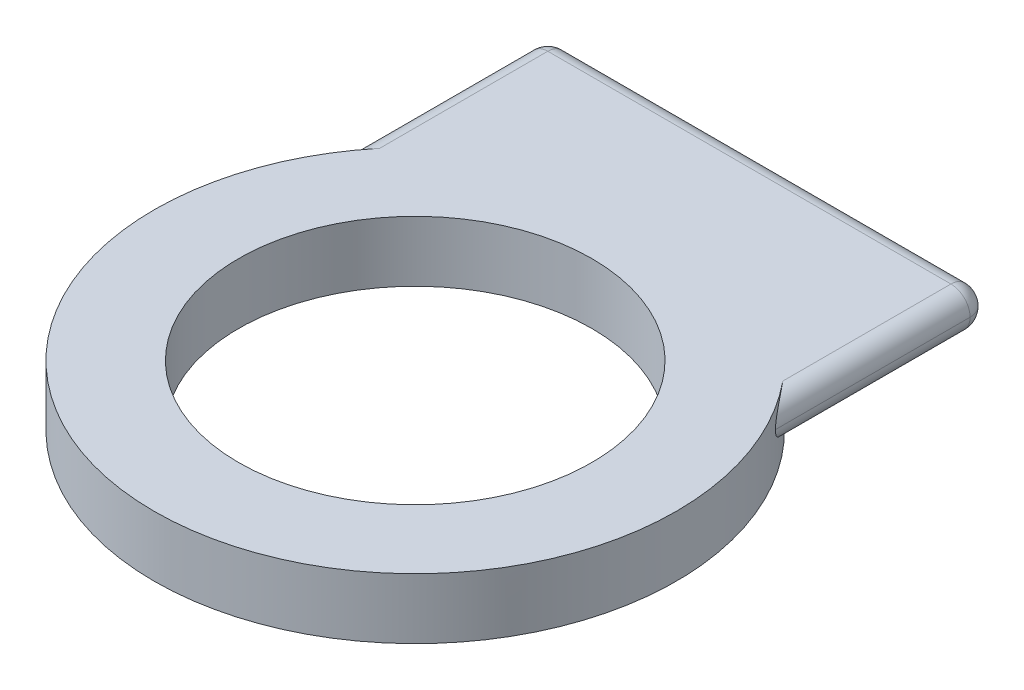
ISO-10303-21;
HEADER;
FILE_DESCRIPTION(('STEP AP214'),'2;1');
FILE_NAME('part.step','',(''),(''),'','','');
FILE_SCHEMA(('AUTOMOTIVE_DESIGN { 1 0 10303 214 1 1 1 1 }'));
ENDSEC;
DATA;
#1=APPLICATION_CONTEXT('core data for automotive mechanical design processes');
#2=APPLICATION_PROTOCOL_DEFINITION('international standard','automotive_design',2000,#1);
#3=PRODUCT_CONTEXT('',#1,'mechanical');
#4=PRODUCT('Part','Part','',(#3));
#5=PRODUCT_RELATED_PRODUCT_CATEGORY('part','',(#4));
#6=PRODUCT_DEFINITION_FORMATION('','',#4);
#7=PRODUCT_DEFINITION_CONTEXT('part definition',#1,'design');
#8=PRODUCT_DEFINITION('design','',#6,#7);
#9=PRODUCT_DEFINITION_SHAPE('','',#8);
#10=(LENGTH_UNIT() NAMED_UNIT(*) SI_UNIT(.MILLI.,.METRE.));
#11=(NAMED_UNIT(*) PLANE_ANGLE_UNIT() SI_UNIT($,.RADIAN.));
#12=(NAMED_UNIT(*) SI_UNIT($,.STERADIAN.) SOLID_ANGLE_UNIT());
#13=UNCERTAINTY_MEASURE_WITH_UNIT(LENGTH_MEASURE(1.E-05),#10,'distance_accuracy_value','');
#14=(GEOMETRIC_REPRESENTATION_CONTEXT(3) GLOBAL_UNCERTAINTY_ASSIGNED_CONTEXT((#13)) GLOBAL_UNIT_ASSIGNED_CONTEXT((#10,
#11,#12)) REPRESENTATION_CONTEXT('',''));
#15=CARTESIAN_POINT('',(0.,0.,0.));
#16=DIRECTION('',(0.,0.,1.));
#17=DIRECTION('',(1.,0.,0.));
#18=AXIS2_PLACEMENT_3D('',#15,#16,#17);
#19=CARTESIAN_POINT('',(0.,7.6,0.));
#20=DIRECTION('',(0.,-1.,0.));
#21=DIRECTION('',(0.,0.,-1.));
#22=AXIS2_PLACEMENT_3D('',#19,#20,#21);
#23=PLANE('',#22);
#24=CARTESIAN_POINT('',(43.735,7.6,0.));
#25=DIRECTION('',(0.,1.,0.));
#26=DIRECTION('',(0.,0.,1.));
#27=AXIS2_PLACEMENT_3D('',#24,#25,#26);
#28=CIRCLE('',#27,35.);
#29=CARTESIAN_POINT('',(43.735,7.6,35.));
#30=VERTEX_POINT('',#29);
#31=EDGE_CURVE('E130',#30,#30,#28,.T.);
#32=ORIENTED_EDGE('',*,*,#31,.F.);
#33=EDGE_LOOP('',(#32));
#34=FACE_BOUND('',#33,.T.);
#35=DIRECTION('',(0.,0.,-1.));
#36=VECTOR('',#35,1.);
#37=CARTESIAN_POINT('',(83.67,7.6,0.));
#38=LINE('',#37,#36);
#39=CARTESIAN_POINT('',(83.67,7.6,-32.8892991716151));
#40=VERTEX_POINT('',#39);
#41=CARTESIAN_POINT('',(83.67,7.6,-66.2));
#42=VERTEX_POINT('',#41);
#43=EDGE_CURVE('E236',#40,#42,#38,.T.);
#44=ORIENTED_EDGE('',*,*,#43,.T.);
#45=DIRECTION('',(-1.,0.,0.));
#46=VECTOR('',#45,1.);
#47=CARTESIAN_POINT('',(0.,7.6,-66.2));
#48=LINE('',#47,#46);
#49=CARTESIAN_POINT('',(3.79999999999997,7.6,-66.2));
#50=VERTEX_POINT('',#49);
#51=EDGE_CURVE('E11',#42,#50,#48,.T.);
#52=ORIENTED_EDGE('',*,*,#51,.T.);
#53=DIRECTION('',(0.,0.,1.));
#54=VECTOR('',#53,1.);
#55=CARTESIAN_POINT('',(3.8,7.6,0.));
#56=LINE('',#55,#54);
#57=CARTESIAN_POINT('',(3.79999999999999,7.6,-32.8892991716151));
#58=VERTEX_POINT('',#57);
#59=EDGE_CURVE('E116',#50,#58,#56,.T.);
#60=ORIENTED_EDGE('',*,*,#59,.T.);
#61=CARTESIAN_POINT('',(43.735,7.6,0.));
#62=DIRECTION('',(0.,1.,0.));
#63=DIRECTION('',(0.,0.,1.));
#64=AXIS2_PLACEMENT_3D('',#61,#62,#63);
#65=CIRCLE('',#64,51.735);
#66=EDGE_CURVE('E83',#58,#40,#65,.T.);
#67=ORIENTED_EDGE('',*,*,#66,.T.);
#68=EDGE_LOOP('',(#44,#52,#60,#67));
#69=FACE_BOUND('',#68,.T.);
#70=ADVANCED_FACE('F41',(#34,#69),#23,.F.);
#71=CARTESIAN_POINT('',(0.,0.,0.));
#72=DIRECTION('',(0.,-1.,0.));
#73=DIRECTION('',(0.,0.,-1.));
#74=AXIS2_PLACEMENT_3D('',#71,#72,#73);
#75=PLANE('',#74);
#76=DIRECTION('',(0.,0.,1.));
#77=VECTOR('',#76,1.);
#78=CARTESIAN_POINT('',(3.79999999999997,0.,-70.));
#79=LINE('',#78,#77);
#80=CARTESIAN_POINT('',(3.79999999999998,0.,-32.8892991716151));
#81=VERTEX_POINT('',#80);
#82=CARTESIAN_POINT('',(3.79999999999997,0.,-66.2));
#83=VERTEX_POINT('',#82);
#84=EDGE_CURVE('E251',#81,#83,#79,.F.);
#85=ORIENTED_EDGE('',*,*,#84,.T.);
#86=DIRECTION('',(-1.,0.,0.));
#87=VECTOR('',#86,1.);
#88=CARTESIAN_POINT('',(83.67,0.,-66.2));
#89=LINE('',#88,#87);
#90=CARTESIAN_POINT('',(83.67,0.,-66.2));
#91=VERTEX_POINT('',#90);
#92=EDGE_CURVE('E52',#83,#91,#89,.F.);
#93=ORIENTED_EDGE('',*,*,#92,.T.);
#94=DIRECTION('',(0.,0.,-1.));
#95=VECTOR('',#94,1.);
#96=CARTESIAN_POINT('',(83.67,0.,-27.6362081335338));
#97=LINE('',#96,#95);
#98=CARTESIAN_POINT('',(83.67,0.,-32.8892991716151));
#99=VERTEX_POINT('',#98);
#100=EDGE_CURVE('E243',#91,#99,#97,.F.);
#101=ORIENTED_EDGE('',*,*,#100,.T.);
#102=CARTESIAN_POINT('',(43.735,0.,0.));
#103=DIRECTION('',(0.,-1.,0.));
#104=DIRECTION('',(0.,0.,-1.));
#105=AXIS2_PLACEMENT_3D('',#102,#103,#104);
#106=CIRCLE('',#105,51.735);
#107=EDGE_CURVE('E239',#81,#99,#106,.T.);
#108=ORIENTED_EDGE('',*,*,#107,.F.);
#109=EDGE_LOOP('',(#85,#93,#101,#108));
#110=FACE_BOUND('',#109,.T.);
#111=ADVANCED_FACE('F192',(#110),#75,.T.);
#112=CARTESIAN_POINT('',(43.735,-4.4,0.));
#113=DIRECTION('',(0.,1.,0.));
#114=DIRECTION('',(0.,0.,1.));
#115=AXIS2_PLACEMENT_3D('',#112,#113,#114);
#116=CYLINDRICAL_SURFACE('',#115,51.735);
#117=CARTESIAN_POINT('',(43.735,-4.4,0.));
#118=DIRECTION('',(0.,1.,0.));
#119=DIRECTION('',(0.,0.,1.));
#120=AXIS2_PLACEMENT_3D('',#117,#118,#119);
#121=CIRCLE('',#120,51.735);
#122=CARTESIAN_POINT('',(43.735,-4.4,51.735));
#123=VERTEX_POINT('',#122);
#124=EDGE_CURVE('E246',#123,#123,#121,.T.);
#125=ORIENTED_EDGE('',*,*,#124,.T.);
#126=EDGE_LOOP('',(#125));
#127=FACE_BOUND('',#126,.T.);
#128=CARTESIAN_POINT('',(3.79999999999999,7.6,-32.8892991716151));
#129=CARTESIAN_POINT('',(3.71469556007842,7.59999384747334,-32.7857214774697));
#130=CARTESIAN_POINT('',(3.62980879891848,7.59712811205934,-32.6818273723485));
#131=CARTESIAN_POINT('',(3.46099847994803,7.58579499000001,-32.4735736125287));
#132=CARTESIAN_POINT('',(3.37707485917635,7.57732797166109,-32.3692139888879));
#133=CARTESIAN_POINT('',(3.12678477556983,7.54368198926442,-32.05549308111));
#134=CARTESIAN_POINT('',(2.96204161212026,7.5102584913427,-31.8456628481461));
#135=CARTESIAN_POINT('',(2.63633022087527,7.42141852769675,-31.4242147377831));
#136=CARTESIAN_POINT('',(2.47541859461478,7.36577836141685,-31.2126007943142));
#137=CARTESIAN_POINT('',(2.16024823997111,7.23227343007639,-30.7915454313085));
#138=CARTESIAN_POINT('',(2.00598554673415,7.15442212694311,-30.5821027752221));
#139=CARTESIAN_POINT('',(1.76399036087118,7.01030133122752,-30.248454944916));
#140=CARTESIAN_POINT('',(1.67377064205366,6.95135264078498,-30.122857856602));
#141=CARTESIAN_POINT('',(1.49664790933312,6.8243099301136,-29.8739876238207));
#142=CARTESIAN_POINT('',(1.40974413106234,6.75621803406884,-29.7507139471326));
#143=CARTESIAN_POINT('',(1.23994065009832,6.61044298351549,-29.5076612107625));
#144=CARTESIAN_POINT('',(1.15703128547343,6.53278477590744,-29.3878740280102));
#145=CARTESIAN_POINT('',(0.995678826372246,6.36693530059249,-29.1527182661153));
#146=CARTESIAN_POINT('',(0.917233987326776,6.27874818950039,-29.0373479668693));
#147=CARTESIAN_POINT('',(0.74465521075111,6.06466700504675,-28.7814240433047));
#148=CARTESIAN_POINT('',(0.652202406158888,5.93509783619734,-28.6427580710088));
#149=CARTESIAN_POINT('',(0.479012113817678,5.65423976372121,-28.3805268399085));
#150=CARTESIAN_POINT('',(0.398264439177437,5.50296997692993,-28.2569484654355));
#151=CARTESIAN_POINT('',(0.275037919639716,5.22491810392835,-28.0668978369696));
#152=CARTESIAN_POINT('',(0.228315464736654,5.10420356530421,-27.9943650516256));
#153=CARTESIAN_POINT('',(0.145863496062249,4.8511119951558,-27.8658073214561));
#154=CARTESIAN_POINT('',(0.110087683272181,4.71878721639265,-27.8097128941162));
#155=CARTESIAN_POINT('',(0.068259475654948,4.5198010892386,-27.7439468326287));
#156=CARTESIAN_POINT('',(0.0566808104653116,4.45704833824814,-27.7257103158914));
#157=CARTESIAN_POINT('',(0.0365738418719414,4.3298696412493,-27.6940088504124));
#158=CARTESIAN_POINT('',(0.0280445319188344,4.26544425490015,-27.6805423271765));
#159=CARTESIAN_POINT('',(0.0141792184570396,4.13456736135598,-27.6586376482032));
#160=CARTESIAN_POINT('',(0.008884141271696,4.06810063406508,-27.6502639429584));
#161=CARTESIAN_POINT('',(0.00178327825758681,3.93443022168078,-27.6390301800147));
#162=CARTESIAN_POINT('',(-1.77637652969275E-05,3.86722565907579,-27.6361776183124));
#163=CARTESIAN_POINT('',(0.,3.80000000000001,-27.6362081335338));
#164=B_SPLINE_CURVE_WITH_KNOTS('',3,(#128,#129,#130,#131,#132,#133,#134,#135,#136,#137,#138,
#139,#140,#141,#142,#143,#144,#145,#146,#147,#148,#149,#150,#151,#152,#153,#154,#155,#156,#157,
#158,#159,#160,#161,#162,#163),.UNSPECIFIED.,.F.,.F.,(4,2,2,2,2,2,2,2,2,2,2,2,2,2,2,2,2,4),(0.,
0.402479189766944,0.804931917572844,1.61050787827565,2.42440845575459,3.23781678113685,
3.73405338393097,4.230174897989,4.72502898482503,5.21968835447703,5.85151109971324,
6.48278062964281,6.92659171699392,7.3684988888871,7.56738345539281,7.76620231214935,
7.96748756542652,8.1690459103346),.UNSPECIFIED.);
#165=CARTESIAN_POINT('',(0.,3.8,-27.6362081335338));
#166=VERTEX_POINT('',#165);
#167=EDGE_CURVE('E199',#58,#166,#164,.T.);
#168=ORIENTED_EDGE('',*,*,#167,.T.);
#169=CARTESIAN_POINT('',(0.,3.8,-27.6362081335338));
#170=CARTESIAN_POINT('',(-1.24753446516048E-05,3.73855316252409,-27.6361866967805));
#171=CARTESIAN_POINT('',(0.00149001872063346,3.67712027300878,-27.6385660972869));
#172=CARTESIAN_POINT('',(0.00742778175831767,3.55481574136678,-27.6479602948402));
#173=CARTESIAN_POINT('',(0.01185996201994,3.49394357653564,-27.654970210021));
#174=CARTESIAN_POINT('',(0.0234989759193564,3.37379561882038,-27.6733628799707));
#175=CARTESIAN_POINT('',(0.0306762343887525,3.31450978045414,-27.6846990216969));
#176=CARTESIAN_POINT('',(0.0476397100262319,3.19724899057531,-27.7114602128539));
#177=CARTESIAN_POINT('',(0.0574267400972757,3.1392744536269,-27.7268865363037));
#178=CARTESIAN_POINT('',(0.0956940065959322,2.94042052889634,-27.7871155359296));
#179=CARTESIAN_POINT('',(0.130431094097712,2.8035839110526,-27.8416504287833));
#180=CARTESIAN_POINT('',(0.211681671521342,2.54184866306185,-27.9684935029785));
#181=CARTESIAN_POINT('',(0.258247569317254,2.41700665979052,-28.04088073691));
#182=CARTESIAN_POINT('',(0.348521096764718,2.20715607943326,-28.1802931360187));
#183=CARTESIAN_POINT('',(0.390421351149444,2.11959132257437,-28.2447201236818));
#184=CARTESIAN_POINT('',(0.478565336503998,1.95146268775934,-28.3795272732874));
#185=CARTESIAN_POINT('',(0.524811476591008,1.87090274108576,-28.4499107349925));
#186=CARTESIAN_POINT('',(0.620935435813071,1.71629062346149,-28.5953715316922));
#187=CARTESIAN_POINT('',(0.670817640417879,1.64224655697765,-28.6704545188514));
#188=CARTESIAN_POINT('',(0.773618086170972,1.50028460134251,-28.8242686429666));
#189=CARTESIAN_POINT('',(0.826537431839837,1.43236896431801,-28.9030011051034));
#190=CARTESIAN_POINT('',(0.973465558327565,1.25604535918959,-29.1202457351013));
#191=CARTESIAN_POINT('',(1.06997867741309,1.15311181704347,-29.2615238878531));
#192=CARTESIAN_POINT('',(1.26909870522624,0.962118978408905,-29.549758315804));
#193=CARTESIAN_POINT('',(1.37170973641316,0.87406990270618,-29.6967184082456));
#194=CARTESIAN_POINT('',(1.58224793019104,0.711423409230785,-29.9948177461719));
#195=CARTESIAN_POINT('',(1.690187070982,0.636858238193799,-30.1459660385691));
#196=CARTESIAN_POINT('',(1.91045350504117,0.500547530286822,-30.4508280170815));
#197=CARTESIAN_POINT('',(2.02278156299224,0.438804239318893,-30.6045421475475));
#198=CARTESIAN_POINT('',(2.2680204403075,0.319444815010382,-30.9361980871174));
#199=CARTESIAN_POINT('',(2.40153519798646,0.263759583185151,-31.1143891479582));
#200=CARTESIAN_POINT('',(2.6729305947039,0.168139065562699,-31.4716863217938));
#201=CARTESIAN_POINT('',(2.81081189819856,0.128206189359102,-31.6507925705411));
#202=CARTESIAN_POINT('',(3.08892748069508,0.0644247803813914,-32.0071487072149));
#203=CARTESIAN_POINT('',(3.22912461475329,0.0404199152442135,-32.1843993063721));
#204=CARTESIAN_POINT('',(3.44164699516125,0.016263443286145,-32.4494802623775));
#205=CARTESIAN_POINT('',(3.51285377770689,0.0101864344515244,-32.5377018678964));
#206=CARTESIAN_POINT('',(3.65594134952687,0.00205616581826982,-32.7137915708188));
#207=CARTESIAN_POINT('',(3.72782217970748,3.15183464293342E-06,-32.801659646299));
#208=CARTESIAN_POINT('',(3.79999999999998,0.,-32.8892991716151));
#209=B_SPLINE_CURVE_WITH_KNOTS('',3,(#169,#170,#171,#172,#173,#174,#175,#176,#177,#178,#179,
#180,#181,#182,#183,#184,#185,#186,#187,#188,#189,#190,#191,#192,#193,#194,#195,#196,#197,#198,
#199,#200,#201,#202,#203,#204,#205,#206,#207,#208),.UNSPECIFIED.,.F.,.F.,(4,2,2,2,2,2,2,2,2,2,2,
2,2,2,2,2,2,2,2,4),(0.,0.184253445454387,0.368312945280475,0.550442858855,0.732629569445995,
1.18394749481088,1.63730097642397,1.9863479708948,2.33558961201785,2.68525967579646,
3.03505772035999,3.63313550635196,4.23162232352176,4.83152201949613,5.43152670644128,
6.11946240220559,6.80750328879363,7.48868707098351,7.82923070777458,8.16979514681091),.UNSPECIFIED.);
#210=EDGE_CURVE('E128',#166,#81,#209,.T.);
#211=ORIENTED_EDGE('',*,*,#210,.T.);
#212=ORIENTED_EDGE('',*,*,#107,.T.);
#213=CARTESIAN_POINT('',(83.67,0.,-32.8892991716151));
#214=CARTESIAN_POINT('',(83.7553044399216,6.15252666352142E-06,-32.7857214774697));
#215=CARTESIAN_POINT('',(83.8401912010815,0.00287188794066329,-32.6818273723485));
#216=CARTESIAN_POINT('',(84.009001520052,0.0142050099999874,-32.4735736125287));
#217=CARTESIAN_POINT('',(84.0929251408236,0.022672028338909,-32.369213988888));
#218=CARTESIAN_POINT('',(84.3432152244302,0.0563180107355835,-32.05549308111));
#219=CARTESIAN_POINT('',(84.5079583878797,0.0897415086573033,-31.8456628481461));
#220=CARTESIAN_POINT('',(84.8336697791247,0.178581472303245,-31.4242147377832));
#221=CARTESIAN_POINT('',(84.9945814053852,0.234221638583152,-31.2126007943143));
#222=CARTESIAN_POINT('',(85.3097517600289,0.367726569923607,-30.7915454313085));
#223=CARTESIAN_POINT('',(85.4640144532658,0.445577873056887,-30.5821027752221));
#224=CARTESIAN_POINT('',(85.7060096391288,0.589698668772477,-30.248454944916));
#225=CARTESIAN_POINT('',(85.7962293579463,0.648647359215015,-30.1228578566021));
#226=CARTESIAN_POINT('',(85.9733520906669,0.775690069886396,-29.8739876238207));
#227=CARTESIAN_POINT('',(86.0602558689376,0.843781965931163,-29.7507139471327));
#228=CARTESIAN_POINT('',(86.2300593499017,0.989557016484509,-29.5076612107625));
#229=CARTESIAN_POINT('',(86.3129687145265,1.06721522409255,-29.3878740280103));
#230=CARTESIAN_POINT('',(86.4743211736277,1.23306469940751,-29.1527182661154));
#231=CARTESIAN_POINT('',(86.5527660126732,1.32125181049961,-29.0373479668694));
#232=CARTESIAN_POINT('',(86.7253447892489,1.53533299495326,-28.7814240433047));
#233=CARTESIAN_POINT('',(86.8177975938411,1.66490216380267,-28.6427580710089));
#234=CARTESIAN_POINT('',(86.9909878861823,1.9457602362788,-28.3805268399086));
#235=CARTESIAN_POINT('',(87.0717355608225,2.09703002307007,-28.2569484654356));
#236=CARTESIAN_POINT('',(87.1949620803603,2.37508189607165,-28.0668978369696));
#237=CARTESIAN_POINT('',(87.2416845352633,2.49579643469579,-27.9943650516256));
#238=CARTESIAN_POINT('',(87.3241365039378,2.74888800484421,-27.8658073214561));
#239=CARTESIAN_POINT('',(87.3599123167278,2.88121278360736,-27.8097128941162));
#240=CARTESIAN_POINT('',(87.401740524345,3.08019891076141,-27.7439468326288));
#241=CARTESIAN_POINT('',(87.4133191895347,3.14295166175187,-27.7257103158914));
#242=CARTESIAN_POINT('',(87.433426158128,3.27013035875071,-27.6940088504125));
#243=CARTESIAN_POINT('',(87.4419554680812,3.33455574509986,-27.6805423271765));
#244=CARTESIAN_POINT('',(87.455820781543,3.46543263864403,-27.6586376482032));
#245=CARTESIAN_POINT('',(87.4611158587283,3.53189936593493,-27.6502639429585));
#246=CARTESIAN_POINT('',(87.4682167217424,3.66556977831922,-27.6390301800148));
#247=CARTESIAN_POINT('',(87.4700177637653,3.73277434092421,-27.6361776183125));
#248=CARTESIAN_POINT('',(87.47,3.79999999999999,-27.6362081335338));
#249=B_SPLINE_CURVE_WITH_KNOTS('',3,(#213,#214,#215,#216,#217,#218,#219,#220,#221,#222,#223,
#224,#225,#226,#227,#228,#229,#230,#231,#232,#233,#234,#235,#236,#237,#238,#239,#240,#241,#242,
#243,#244,#245,#246,#247,#248),.UNSPECIFIED.,.F.,.F.,(4,2,2,2,2,2,2,2,2,2,2,2,2,2,2,2,2,4),(0.,
0.402479189766946,0.804931917572841,1.61050787827564,2.42440845575457,3.23781678113684,
3.73405338393096,4.23017489798901,4.72502898482503,5.21968835447703,5.85151109971324,
6.48278062964281,6.92659171699393,7.3684988888871,7.56738345539281,7.76620231214935,
7.96748756542652,8.1690459103346),.UNSPECIFIED.);
#250=CARTESIAN_POINT('',(87.47,3.8,-27.6362081335338));
#251=VERTEX_POINT('',#250);
#252=EDGE_CURVE('E176',#99,#251,#249,.T.);
#253=ORIENTED_EDGE('',*,*,#252,.T.);
#254=CARTESIAN_POINT('',(87.47,3.8,-27.6362081335338));
#255=CARTESIAN_POINT('',(87.4700124753446,3.86144683747591,-27.6361866967805));
#256=CARTESIAN_POINT('',(87.4685099812793,3.92287972699123,-27.6385660972869));
#257=CARTESIAN_POINT('',(87.4625722182417,4.04518425863322,-27.6479602948402));
#258=CARTESIAN_POINT('',(87.4581400379801,4.10605642346436,-27.654970210021));
#259=CARTESIAN_POINT('',(87.4465010240806,4.22620438117962,-27.6733628799707));
#260=CARTESIAN_POINT('',(87.4393237656112,4.28549021954587,-27.6846990216969));
#261=CARTESIAN_POINT('',(87.4223602899738,4.4027510094247,-27.7114602128539));
#262=CARTESIAN_POINT('',(87.4125732599027,4.4607255463731,-27.7268865363038));
#263=CARTESIAN_POINT('',(87.374305993404,4.65957947110365,-27.7871155359297));
#264=CARTESIAN_POINT('',(87.3395689059023,4.7964160889474,-27.8416504287834));
#265=CARTESIAN_POINT('',(87.2583183284787,5.05815133693816,-27.9684935029786));
#266=CARTESIAN_POINT('',(87.2117524306827,5.18299334020948,-28.0408807369101));
#267=CARTESIAN_POINT('',(87.1214789032353,5.39284392056674,-28.1802931360187));
#268=CARTESIAN_POINT('',(87.0795786488505,5.48040867742564,-28.2447201236818));
#269=CARTESIAN_POINT('',(86.991434663496,5.64853731224066,-28.3795272732874));
#270=CARTESIAN_POINT('',(86.945188523409,5.72909725891424,-28.4499107349925));
#271=CARTESIAN_POINT('',(86.8490645641869,5.88370937653851,-28.5953715316923));
#272=CARTESIAN_POINT('',(86.7991823595821,5.95775344302235,-28.6704545188515));
#273=CARTESIAN_POINT('',(86.696381913829,6.09971539865749,-28.8242686429666));
#274=CARTESIAN_POINT('',(86.6434625681601,6.16763103568199,-28.9030011051034));
#275=CARTESIAN_POINT('',(86.4965344416724,6.34395464081041,-29.1202457351014));
#276=CARTESIAN_POINT('',(86.4000213225869,6.44688818295654,-29.2615238878532));
#277=CARTESIAN_POINT('',(86.2009012947737,6.63788102159109,-29.5497583158041));
#278=CARTESIAN_POINT('',(86.0982902635868,6.72593009729382,-29.6967184082456));
#279=CARTESIAN_POINT('',(85.8877520698089,6.88857659076922,-29.9948177461719));
#280=CARTESIAN_POINT('',(85.779812929018,6.96314176180621,-30.1459660385691));
#281=CARTESIAN_POINT('',(85.5595464949588,7.09945246971319,-30.4508280170816));
#282=CARTESIAN_POINT('',(85.4472184370077,7.16119576068111,-30.6045421475475));
#283=CARTESIAN_POINT('',(85.2019795596925,7.28055518498962,-30.9361980871175));
#284=CARTESIAN_POINT('',(85.0684648020135,7.33624041681485,-31.1143891479582));
#285=CARTESIAN_POINT('',(84.7970694052961,7.4318609344373,-31.4716863217938));
#286=CARTESIAN_POINT('',(84.6591881018014,7.4717938106409,-31.6507925705411));
#287=CARTESIAN_POINT('',(84.3810725193049,7.53557521961861,-32.0071487072149));
#288=CARTESIAN_POINT('',(84.2408753852467,7.55958008475579,-32.1843993063721));
#289=CARTESIAN_POINT('',(84.0283530048387,7.58373655671385,-32.4494802623776));
#290=CARTESIAN_POINT('',(83.9571462222931,7.58981356554847,-32.5377018678964));
#291=CARTESIAN_POINT('',(83.8140586504731,7.59794383418173,-32.7137915708188));
#292=CARTESIAN_POINT('',(83.7421778202925,7.59999684816536,-32.801659646299));
#293=CARTESIAN_POINT('',(83.67,7.6,-32.8892991716151));
#294=B_SPLINE_CURVE_WITH_KNOTS('',3,(#254,#255,#256,#257,#258,#259,#260,#261,#262,#263,#264,
#265,#266,#267,#268,#269,#270,#271,#272,#273,#274,#275,#276,#277,#278,#279,#280,#281,#282,#283,
#284,#285,#286,#287,#288,#289,#290,#291,#292,#293),.UNSPECIFIED.,.F.,.F.,(4,2,2,2,2,2,2,2,2,2,2,
2,2,2,2,2,2,2,2,4),(0.,0.184253445454388,0.368312945280475,0.550442858855,0.732629569445999,
1.18394749481088,1.63730097642396,1.9863479708948,2.33558961201786,2.68525967579646,
3.03505772035999,3.63313550635196,4.23162232352177,4.83152201949615,5.43152670644129,
6.1194624022056,6.80750328879363,7.48868707098349,7.82923070777455,8.1697951468109),.UNSPECIFIED.);
#295=EDGE_CURVE('E166',#251,#40,#294,.T.);
#296=ORIENTED_EDGE('',*,*,#295,.T.);
#297=ORIENTED_EDGE('',*,*,#66,.F.);
#298=EDGE_LOOP('',(#168,#211,#212,#253,#296,#297));
#299=FACE_BOUND('',#298,.T.);
#300=ADVANCED_FACE('F186',(#127,#299),#116,.T.);
#301=CARTESIAN_POINT('',(43.735,-4.4,0.));
#302=DIRECTION('',(0.,1.,0.));
#303=DIRECTION('',(0.,0.,1.));
#304=AXIS2_PLACEMENT_3D('',#301,#302,#303);
#305=PLANE('',#304);
#306=CARTESIAN_POINT('',(43.735,-4.4,0.));
#307=DIRECTION('',(0.,1.,0.));
#308=DIRECTION('',(0.,0.,1.));
#309=AXIS2_PLACEMENT_3D('',#306,#307,#308);
#310=CIRCLE('',#309,35.);
#311=CARTESIAN_POINT('',(43.735,-4.4,35.));
#312=VERTEX_POINT('',#311);
#313=EDGE_CURVE('E258',#312,#312,#310,.T.);
#314=ORIENTED_EDGE('',*,*,#313,.T.);
#315=EDGE_LOOP('',(#314));
#316=FACE_BOUND('',#315,.T.);
#317=ORIENTED_EDGE('',*,*,#124,.F.);
#318=EDGE_LOOP('',(#317));
#319=FACE_BOUND('',#318,.T.);
#320=ADVANCED_FACE('F191',(#316,#319),#305,.F.);
#321=CARTESIAN_POINT('',(43.735,-4.4,0.));
#322=DIRECTION('',(0.,1.,0.));
#323=DIRECTION('',(0.,0.,1.));
#324=AXIS2_PLACEMENT_3D('',#321,#322,#323);
#325=CYLINDRICAL_SURFACE('',#324,35.);
#326=ORIENTED_EDGE('',*,*,#313,.F.);
#327=EDGE_LOOP('',(#326));
#328=FACE_BOUND('',#327,.T.);
#329=ORIENTED_EDGE('',*,*,#31,.T.);
#330=EDGE_LOOP('',(#329));
#331=FACE_BOUND('',#330,.T.);
#332=ADVANCED_FACE('F194',(#328,#331),#325,.F.);
#333=CARTESIAN_POINT('',(3.8,3.8,0.));
#334=DIRECTION('',(0.,0.,-1.));
#335=DIRECTION('',(-1.,0.,0.));
#336=AXIS2_PLACEMENT_3D('',#333,#334,#335);
#337=CYLINDRICAL_SURFACE('',#336,3.8);
#338=DIRECTION('',(0.,0.,1.));
#339=VECTOR('',#338,1.);
#340=CARTESIAN_POINT('',(0.,3.8,-27.6362081335338));
#341=LINE('',#340,#339);
#342=CARTESIAN_POINT('',(0.,3.8,-66.2));
#343=VERTEX_POINT('',#342);
#344=EDGE_CURVE('E114',#343,#166,#341,.T.);
#345=ORIENTED_EDGE('',*,*,#344,.F.);
#346=CARTESIAN_POINT('',(3.79999999999997,3.8,-66.2));
#347=DIRECTION('',(0.,0.,-1.));
#348=DIRECTION('',(-1.,0.,0.));
#349=AXIS2_PLACEMENT_3D('',#346,#347,#348);
#350=CIRCLE('',#349,3.8);
#351=EDGE_CURVE('E121',#343,#83,#350,.F.);
#352=ORIENTED_EDGE('',*,*,#351,.T.);
#353=ORIENTED_EDGE('',*,*,#84,.F.);
#354=ORIENTED_EDGE('',*,*,#210,.F.);
#355=EDGE_LOOP('',(#345,#352,#353,#354));
#356=FACE_BOUND('',#355,.T.);
#357=ADVANCED_FACE('F125',(#356),#337,.T.);
#358=CARTESIAN_POINT('',(3.8,3.8,0.));
#359=DIRECTION('',(0.,0.,1.));
#360=DIRECTION('',(1.,0.,0.));
#361=AXIS2_PLACEMENT_3D('',#358,#359,#360);
#362=CYLINDRICAL_SURFACE('',#361,3.8);
#363=ORIENTED_EDGE('',*,*,#59,.F.);
#364=CARTESIAN_POINT('',(3.79999999999997,3.8,-66.2));
#365=DIRECTION('',(0.,0.,1.));
#366=DIRECTION('',(1.,0.,0.));
#367=AXIS2_PLACEMENT_3D('',#364,#365,#366);
#368=CIRCLE('',#367,3.8);
#369=EDGE_CURVE('E110',#50,#343,#368,.T.);
#370=ORIENTED_EDGE('',*,*,#369,.T.);
#371=ORIENTED_EDGE('',*,*,#344,.T.);
#372=ORIENTED_EDGE('',*,*,#167,.F.);
#373=EDGE_LOOP('',(#363,#370,#371,#372));
#374=FACE_BOUND('',#373,.T.);
#375=ADVANCED_FACE('F112',(#374),#362,.T.);
#376=CARTESIAN_POINT('',(83.67,3.8,0.));
#377=DIRECTION('',(0.,0.,-1.));
#378=DIRECTION('',(-1.,0.,0.));
#379=AXIS2_PLACEMENT_3D('',#376,#377,#378);
#380=CYLINDRICAL_SURFACE('',#379,3.8);
#381=DIRECTION('',(0.,0.,-1.));
#382=VECTOR('',#381,1.);
#383=CARTESIAN_POINT('',(87.47,3.8,0.));
#384=LINE('',#383,#382);
#385=CARTESIAN_POINT('',(87.47,3.8,-66.2));
#386=VERTEX_POINT('',#385);
#387=EDGE_CURVE('E131',#386,#251,#384,.F.);
#388=ORIENTED_EDGE('',*,*,#387,.F.);
#389=CARTESIAN_POINT('',(83.67,3.8,-66.2));
#390=DIRECTION('',(0.,0.,-1.));
#391=DIRECTION('',(-1.,0.,0.));
#392=AXIS2_PLACEMENT_3D('',#389,#390,#391);
#393=CIRCLE('',#392,3.8);
#394=EDGE_CURVE('E163',#386,#42,#393,.F.);
#395=ORIENTED_EDGE('',*,*,#394,.T.);
#396=ORIENTED_EDGE('',*,*,#43,.F.);
#397=ORIENTED_EDGE('',*,*,#295,.F.);
#398=EDGE_LOOP('',(#388,#395,#396,#397));
#399=FACE_BOUND('',#398,.T.);
#400=ADVANCED_FACE('F183',(#399),#380,.T.);
#401=CARTESIAN_POINT('',(83.67,3.8,0.));
#402=DIRECTION('',(0.,0.,1.));
#403=DIRECTION('',(1.,0.,0.));
#404=AXIS2_PLACEMENT_3D('',#401,#402,#403);
#405=CYLINDRICAL_SURFACE('',#404,3.8);
#406=ORIENTED_EDGE('',*,*,#100,.F.);
#407=CARTESIAN_POINT('',(83.67,3.8,-66.2));
#408=DIRECTION('',(0.,0.,1.));
#409=DIRECTION('',(1.,0.,0.));
#410=AXIS2_PLACEMENT_3D('',#407,#408,#409);
#411=CIRCLE('',#410,3.8);
#412=EDGE_CURVE('E136',#91,#386,#411,.T.);
#413=ORIENTED_EDGE('',*,*,#412,.T.);
#414=ORIENTED_EDGE('',*,*,#387,.T.);
#415=ORIENTED_EDGE('',*,*,#252,.F.);
#416=EDGE_LOOP('',(#406,#413,#414,#415));
#417=FACE_BOUND('',#416,.T.);
#418=ADVANCED_FACE('F217',(#417),#405,.T.);
#419=CARTESIAN_POINT('',(3.79999999999997,3.8,-66.2));
#420=DIRECTION('',(0.,0.,1.));
#421=DIRECTION('',(1.,0.,0.));
#422=AXIS2_PLACEMENT_3D('',#419,#420,#421);
#423=SPHERICAL_SURFACE('',#422,3.8);
#424=CARTESIAN_POINT('',(3.79999999999997,3.8,-66.2));
#425=DIRECTION('',(1.,0.,0.));
#426=DIRECTION('',(0.,0.,-1.));
#427=AXIS2_PLACEMENT_3D('',#424,#425,#426);
#428=CIRCLE('',#427,3.8);
#429=CARTESIAN_POINT('',(3.79999999999997,3.8,-70.));
#430=VERTEX_POINT('',#429);
#431=EDGE_CURVE('E133',#83,#430,#428,.T.);
#432=ORIENTED_EDGE('',*,*,#431,.F.);
#433=ORIENTED_EDGE('',*,*,#351,.F.);
#434=CARTESIAN_POINT('',(3.79999999999997,3.8,-66.2));
#435=DIRECTION('',(0.,1.,0.));
#436=DIRECTION('',(0.,0.,1.));
#437=AXIS2_PLACEMENT_3D('',#434,#435,#436);
#438=CIRCLE('',#437,3.8);
#439=EDGE_CURVE('E45',#430,#343,#438,.T.);
#440=ORIENTED_EDGE('',*,*,#439,.F.);
#441=EDGE_LOOP('',(#432,#433,#440));
#442=FACE_BOUND('',#441,.T.);
#443=ADVANCED_FACE('F43',(#442),#423,.T.);
#444=CARTESIAN_POINT('',(3.79999999999997,3.8,-66.2));
#445=DIRECTION('',(0.,0.,1.));
#446=DIRECTION('',(1.,0.,0.));
#447=AXIS2_PLACEMENT_3D('',#444,#445,#446);
#448=SPHERICAL_SURFACE('',#447,3.8);
#449=ORIENTED_EDGE('',*,*,#439,.T.);
#450=ORIENTED_EDGE('',*,*,#369,.F.);
#451=CARTESIAN_POINT('',(3.79999999999997,3.8,-66.2));
#452=DIRECTION('',(1.,0.,0.));
#453=DIRECTION('',(0.,0.,-1.));
#454=AXIS2_PLACEMENT_3D('',#451,#452,#453);
#455=CIRCLE('',#454,3.8);
#456=EDGE_CURVE('E139',#430,#50,#455,.T.);
#457=ORIENTED_EDGE('',*,*,#456,.F.);
#458=EDGE_LOOP('',(#449,#450,#457));
#459=FACE_BOUND('',#458,.T.);
#460=ADVANCED_FACE('F138',(#459),#448,.T.);
#461=CARTESIAN_POINT('',(0.,3.8,-66.2));
#462=DIRECTION('',(1.,0.,0.));
#463=DIRECTION('',(0.,0.,-1.));
#464=AXIS2_PLACEMENT_3D('',#461,#462,#463);
#465=CYLINDRICAL_SURFACE('',#464,3.8);
#466=ORIENTED_EDGE('',*,*,#92,.F.);
#467=ORIENTED_EDGE('',*,*,#431,.T.);
#468=DIRECTION('',(-1.,0.,0.));
#469=VECTOR('',#468,1.);
#470=CARTESIAN_POINT('',(3.79999999999997,3.8,-70.));
#471=LINE('',#470,#469);
#472=CARTESIAN_POINT('',(83.67,3.8,-70.));
#473=VERTEX_POINT('',#472);
#474=EDGE_CURVE('E71',#473,#430,#471,.T.);
#475=ORIENTED_EDGE('',*,*,#474,.F.);
#476=CARTESIAN_POINT('',(83.67,3.8,-66.2));
#477=DIRECTION('',(1.,0.,0.));
#478=DIRECTION('',(0.,0.,-1.));
#479=AXIS2_PLACEMENT_3D('',#476,#477,#478);
#480=CIRCLE('',#479,3.8);
#481=EDGE_CURVE('E149',#91,#473,#480,.T.);
#482=ORIENTED_EDGE('',*,*,#481,.F.);
#483=EDGE_LOOP('',(#466,#467,#475,#482));
#484=FACE_BOUND('',#483,.T.);
#485=ADVANCED_FACE('F331',(#484),#465,.T.);
#486=CARTESIAN_POINT('',(0.,3.8,-66.2));
#487=DIRECTION('',(-1.,0.,0.));
#488=DIRECTION('',(0.,0.,1.));
#489=AXIS2_PLACEMENT_3D('',#486,#487,#488);
#490=CYLINDRICAL_SURFACE('',#489,3.8);
#491=ORIENTED_EDGE('',*,*,#456,.T.);
#492=ORIENTED_EDGE('',*,*,#51,.F.);
#493=CARTESIAN_POINT('',(83.67,3.8,-66.2));
#494=DIRECTION('',(1.,0.,0.));
#495=DIRECTION('',(0.,0.,-1.));
#496=AXIS2_PLACEMENT_3D('',#493,#494,#495);
#497=CIRCLE('',#496,3.8);
#498=EDGE_CURVE('E152',#473,#42,#497,.T.);
#499=ORIENTED_EDGE('',*,*,#498,.F.);
#500=ORIENTED_EDGE('',*,*,#474,.T.);
#501=EDGE_LOOP('',(#491,#492,#499,#500));
#502=FACE_BOUND('',#501,.T.);
#503=ADVANCED_FACE('F340',(#502),#490,.T.);
#504=CARTESIAN_POINT('',(83.67,3.8,-66.2));
#505=DIRECTION('',(0.,0.,1.));
#506=DIRECTION('',(1.,0.,0.));
#507=AXIS2_PLACEMENT_3D('',#504,#505,#506);
#508=SPHERICAL_SURFACE('',#507,3.8);
#509=ORIENTED_EDGE('',*,*,#412,.F.);
#510=ORIENTED_EDGE('',*,*,#481,.T.);
#511=CARTESIAN_POINT('',(83.67,3.8,-66.2));
#512=DIRECTION('',(0.,1.,0.));
#513=DIRECTION('',(0.,0.,1.));
#514=AXIS2_PLACEMENT_3D('',#511,#512,#513);
#515=CIRCLE('',#514,3.8);
#516=EDGE_CURVE('E155',#386,#473,#515,.T.);
#517=ORIENTED_EDGE('',*,*,#516,.F.);
#518=EDGE_LOOP('',(#509,#510,#517));
#519=FACE_BOUND('',#518,.T.);
#520=ADVANCED_FACE('F349',(#519),#508,.T.);
#521=CARTESIAN_POINT('',(83.67,3.8,-66.2));
#522=DIRECTION('',(0.,0.,1.));
#523=DIRECTION('',(1.,0.,0.));
#524=AXIS2_PLACEMENT_3D('',#521,#522,#523);
#525=SPHERICAL_SURFACE('',#524,3.8);
#526=ORIENTED_EDGE('',*,*,#498,.T.);
#527=ORIENTED_EDGE('',*,*,#394,.F.);
#528=ORIENTED_EDGE('',*,*,#516,.T.);
#529=EDGE_LOOP('',(#526,#527,#528));
#530=FACE_BOUND('',#529,.T.);
#531=ADVANCED_FACE('F359',(#530),#525,.T.);
#532=CLOSED_SHELL('',(#70,#111,#300,#320,#332,#357,#375,#400,#418,#443,#460,#485,#503,#520,#531));
#533=MANIFOLD_SOLID_BREP('B2',#532);
#534=ADVANCED_BREP_SHAPE_REPRESENTATION('',(#18,#533),#14);
#535=SHAPE_DEFINITION_REPRESENTATION(#9,#534);
ENDSEC;
END-ISO-10303-21;
